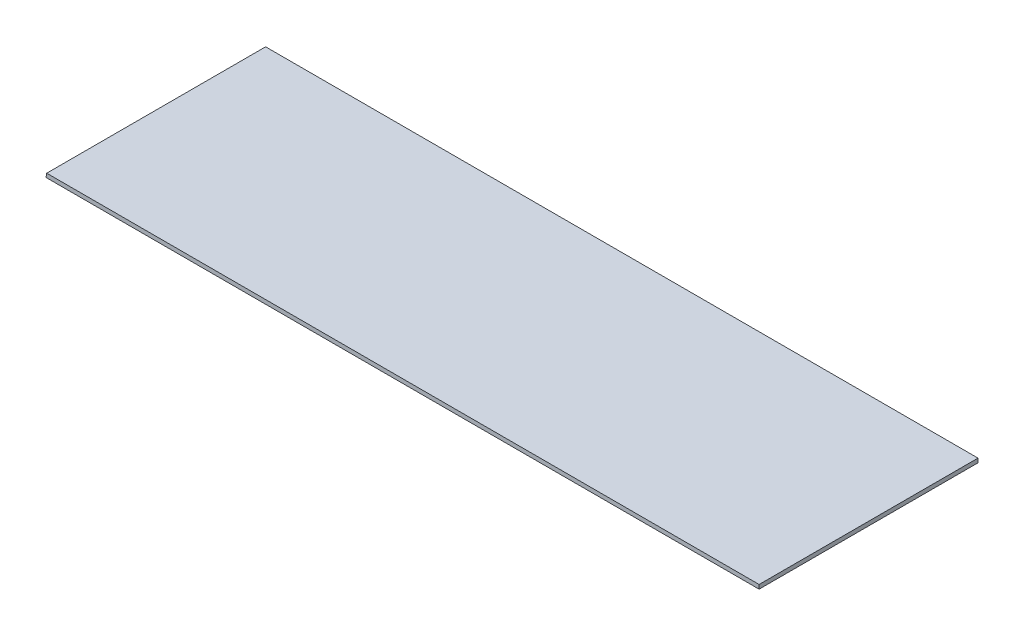
ISO-10303-21;
HEADER;
FILE_DESCRIPTION(('STEP AP214'),'2;1');
FILE_NAME('part.step','',(''),(''),'','','');
FILE_SCHEMA(('AUTOMOTIVE_DESIGN { 1 0 10303 214 1 1 1 1 }'));
ENDSEC;
DATA;
#1=APPLICATION_CONTEXT('core data for automotive mechanical design processes');
#2=APPLICATION_PROTOCOL_DEFINITION('international standard','automotive_design',2000,#1);
#3=PRODUCT_CONTEXT('',#1,'mechanical');
#4=PRODUCT('Part','Part','',(#3));
#5=PRODUCT_RELATED_PRODUCT_CATEGORY('part','',(#4));
#6=PRODUCT_DEFINITION_FORMATION('','',#4);
#7=PRODUCT_DEFINITION_CONTEXT('part definition',#1,'design');
#8=PRODUCT_DEFINITION('design','',#6,#7);
#9=PRODUCT_DEFINITION_SHAPE('','',#8);
#10=(LENGTH_UNIT() NAMED_UNIT(*) SI_UNIT(.MILLI.,.METRE.));
#11=(NAMED_UNIT(*) PLANE_ANGLE_UNIT() SI_UNIT($,.RADIAN.));
#12=(NAMED_UNIT(*) SI_UNIT($,.STERADIAN.) SOLID_ANGLE_UNIT());
#13=UNCERTAINTY_MEASURE_WITH_UNIT(LENGTH_MEASURE(1.E-05),#10,'distance_accuracy_value','');
#14=(GEOMETRIC_REPRESENTATION_CONTEXT(3) GLOBAL_UNCERTAINTY_ASSIGNED_CONTEXT((#13)) GLOBAL_UNIT_ASSIGNED_CONTEXT((#10,
#11,#12)) REPRESENTATION_CONTEXT('',''));
#15=CARTESIAN_POINT('',(0.,0.,0.));
#16=DIRECTION('',(0.,0.,1.));
#17=DIRECTION('',(1.,0.,0.));
#18=AXIS2_PLACEMENT_3D('',#15,#16,#17);
#19=CARTESIAN_POINT('',(-42.0108944845488,2.,23.1059919665018));
#20=DIRECTION('',(0.,0.,-1.));
#21=DIRECTION('',(-1.,0.,0.));
#22=AXIS2_PLACEMENT_3D('',#19,#20,#21);
#23=PLANE('',#22);
#24=DIRECTION('',(1.,0.,0.));
#25=VECTOR('',#24,1.);
#26=CARTESIAN_POINT('',(-42.0108944845488,2.,23.1059919665018));
#27=LINE('',#26,#25);
#28=CARTESIAN_POINT('',(-40.2476246774641,2.,23.1059919665018));
#29=VERTEX_POINT('',#28);
#30=CARTESIAN_POINT('',(307.989105515451,2.,23.1059919665018));
#31=VERTEX_POINT('',#30);
#32=EDGE_CURVE('E74',#29,#31,#27,.T.);
#33=ORIENTED_EDGE('',*,*,#32,.F.);
#34=DIRECTION('',(-0.173648177666937,-0.984807753012207,0.));
#35=VECTOR('',#34,1.);
#36=CARTESIAN_POINT('',(-40.2476246774641,2.,23.1059919665018));
#37=LINE('',#36,#35);
#38=CARTESIAN_POINT('',(-40.600278638881,0.,23.1059919665018));
#39=VERTEX_POINT('',#38);
#40=EDGE_CURVE('E57',#29,#39,#37,.T.);
#41=ORIENTED_EDGE('',*,*,#40,.T.);
#42=DIRECTION('',(1.,0.,0.));
#43=VECTOR('',#42,1.);
#44=CARTESIAN_POINT('',(-42.0108944845488,0.,23.1059919665018));
#45=LINE('',#44,#43);
#46=CARTESIAN_POINT('',(307.989105515451,0.,23.1059919665018));
#47=VERTEX_POINT('',#46);
#48=EDGE_CURVE('E87',#39,#47,#45,.T.);
#49=ORIENTED_EDGE('',*,*,#48,.T.);
#50=DIRECTION('',(0.,-1.,0.));
#51=VECTOR('',#50,1.);
#52=CARTESIAN_POINT('',(307.989105515451,2.,23.1059919665018));
#53=LINE('',#52,#51);
#54=EDGE_CURVE('E86',#31,#47,#53,.T.);
#55=ORIENTED_EDGE('',*,*,#54,.F.);
#56=EDGE_LOOP('',(#33,#41,#49,#55));
#57=FACE_BOUND('',#56,.T.);
#58=ADVANCED_FACE('F35',(#57),#23,.F.);
#59=CARTESIAN_POINT('',(307.989105515451,2.,-83.8940080334982));
#60=DIRECTION('',(-1.,0.,0.));
#61=DIRECTION('',(0.,0.,1.));
#62=AXIS2_PLACEMENT_3D('',#59,#60,#61);
#63=PLANE('',#62);
#64=DIRECTION('',(0.,0.,-1.));
#65=VECTOR('',#64,1.);
#66=CARTESIAN_POINT('',(307.989105515451,0.,-83.8940080334982));
#67=LINE('',#66,#65);
#68=CARTESIAN_POINT('',(307.989105515451,0.,-83.8940080334982));
#69=VERTEX_POINT('',#68);
#70=EDGE_CURVE('E100',#47,#69,#67,.T.);
#71=ORIENTED_EDGE('',*,*,#70,.T.);
#72=DIRECTION('',(0.,-1.,0.));
#73=VECTOR('',#72,1.);
#74=CARTESIAN_POINT('',(307.989105515451,2.,-83.8940080334982));
#75=LINE('',#74,#73);
#76=CARTESIAN_POINT('',(307.989105515451,2.,-83.8940080334982));
#77=VERTEX_POINT('',#76);
#78=EDGE_CURVE('E90',#77,#69,#75,.T.);
#79=ORIENTED_EDGE('',*,*,#78,.F.);
#80=DIRECTION('',(0.,0.,-1.));
#81=VECTOR('',#80,1.);
#82=CARTESIAN_POINT('',(307.989105515451,2.,-83.8940080334982));
#83=LINE('',#82,#81);
#84=EDGE_CURVE('E79',#31,#77,#83,.T.);
#85=ORIENTED_EDGE('',*,*,#84,.F.);
#86=ORIENTED_EDGE('',*,*,#54,.T.);
#87=EDGE_LOOP('',(#71,#79,#85,#86));
#88=FACE_BOUND('',#87,.T.);
#89=ADVANCED_FACE('F92',(#88),#63,.F.);
#90=CARTESIAN_POINT('',(-42.0108944845488,2.,-83.8940080334982));
#91=DIRECTION('',(0.,0.,1.));
#92=DIRECTION('',(1.,0.,0.));
#93=AXIS2_PLACEMENT_3D('',#90,#91,#92);
#94=PLANE('',#93);
#95=DIRECTION('',(-1.,0.,0.));
#96=VECTOR('',#95,1.);
#97=CARTESIAN_POINT('',(-42.0108944845488,0.,-83.8940080334982));
#98=LINE('',#97,#96);
#99=CARTESIAN_POINT('',(-40.600278638881,0.,-83.8940080334982));
#100=VERTEX_POINT('',#99);
#101=EDGE_CURVE('E83',#69,#100,#98,.T.);
#102=ORIENTED_EDGE('',*,*,#101,.T.);
#103=DIRECTION('',(0.173648177666937,0.984807753012207,0.));
#104=VECTOR('',#103,1.);
#105=CARTESIAN_POINT('',(-40.2476246774641,2.,-83.8940080334982));
#106=LINE('',#105,#104);
#107=CARTESIAN_POINT('',(-40.2476246774641,2.,-83.8940080334982));
#108=VERTEX_POINT('',#107);
#109=EDGE_CURVE('E11',#100,#108,#106,.T.);
#110=ORIENTED_EDGE('',*,*,#109,.T.);
#111=DIRECTION('',(-1.,0.,0.));
#112=VECTOR('',#111,1.);
#113=CARTESIAN_POINT('',(-42.0108944845488,2.,-83.8940080334982));
#114=LINE('',#113,#112);
#115=EDGE_CURVE('E95',#77,#108,#114,.T.);
#116=ORIENTED_EDGE('',*,*,#115,.F.);
#117=ORIENTED_EDGE('',*,*,#78,.T.);
#118=EDGE_LOOP('',(#102,#110,#116,#117));
#119=FACE_BOUND('',#118,.T.);
#120=ADVANCED_FACE('F106',(#119),#94,.F.);
#121=CARTESIAN_POINT('',(0.,2.,0.));
#122=DIRECTION('',(0.,1.,0.));
#123=DIRECTION('',(0.,0.,1.));
#124=AXIS2_PLACEMENT_3D('',#121,#122,#123);
#125=PLANE('',#124);
#126=ORIENTED_EDGE('',*,*,#115,.T.);
#127=DIRECTION('',(0.,0.,1.));
#128=VECTOR('',#127,1.);
#129=CARTESIAN_POINT('',(-40.2476246774641,2.,23.1059919665018));
#130=LINE('',#129,#128);
#131=EDGE_CURVE('E82',#108,#29,#130,.T.);
#132=ORIENTED_EDGE('',*,*,#131,.T.);
#133=ORIENTED_EDGE('',*,*,#32,.T.);
#134=ORIENTED_EDGE('',*,*,#84,.T.);
#135=EDGE_LOOP('',(#126,#132,#133,#134));
#136=FACE_BOUND('',#135,.T.);
#137=ADVANCED_FACE('F77',(#136),#125,.T.);
#138=CARTESIAN_POINT('',(0.,0.,0.));
#139=DIRECTION('',(0.,1.,0.));
#140=DIRECTION('',(0.,0.,1.));
#141=AXIS2_PLACEMENT_3D('',#138,#139,#140);
#142=PLANE('',#141);
#143=ORIENTED_EDGE('',*,*,#48,.F.);
#144=DIRECTION('',(0.,0.,-1.));
#145=VECTOR('',#144,1.);
#146=CARTESIAN_POINT('',(-40.600278638881,0.,0.));
#147=LINE('',#146,#145);
#148=EDGE_CURVE('E43',#39,#100,#147,.T.);
#149=ORIENTED_EDGE('',*,*,#148,.T.);
#150=ORIENTED_EDGE('',*,*,#101,.F.);
#151=ORIENTED_EDGE('',*,*,#70,.F.);
#152=EDGE_LOOP('',(#143,#149,#150,#151));
#153=FACE_BOUND('',#152,.T.);
#154=ADVANCED_FACE('F108',(#153),#142,.F.);
#155=CARTESIAN_POINT('',(-40.2476246774641,2.,0.));
#156=DIRECTION('',(-0.984807753012207,0.173648177666937,0.));
#157=DIRECTION('',(0.,0.,-1.));
#158=AXIS2_PLACEMENT_3D('',#155,#156,#157);
#159=PLANE('',#158);
#160=ORIENTED_EDGE('',*,*,#109,.F.);
#161=ORIENTED_EDGE('',*,*,#148,.F.);
#162=ORIENTED_EDGE('',*,*,#40,.F.);
#163=ORIENTED_EDGE('',*,*,#131,.F.);
#164=EDGE_LOOP('',(#160,#161,#162,#163));
#165=FACE_BOUND('',#164,.T.);
#166=ADVANCED_FACE('F37',(#165),#159,.T.);
#167=CLOSED_SHELL('',(#58,#89,#120,#137,#154,#166));
#168=MANIFOLD_SOLID_BREP('B2',#167);
#169=ADVANCED_BREP_SHAPE_REPRESENTATION('',(#18,#168),#14);
#170=SHAPE_DEFINITION_REPRESENTATION(#9,#169);
ENDSEC;
END-ISO-10303-21;
